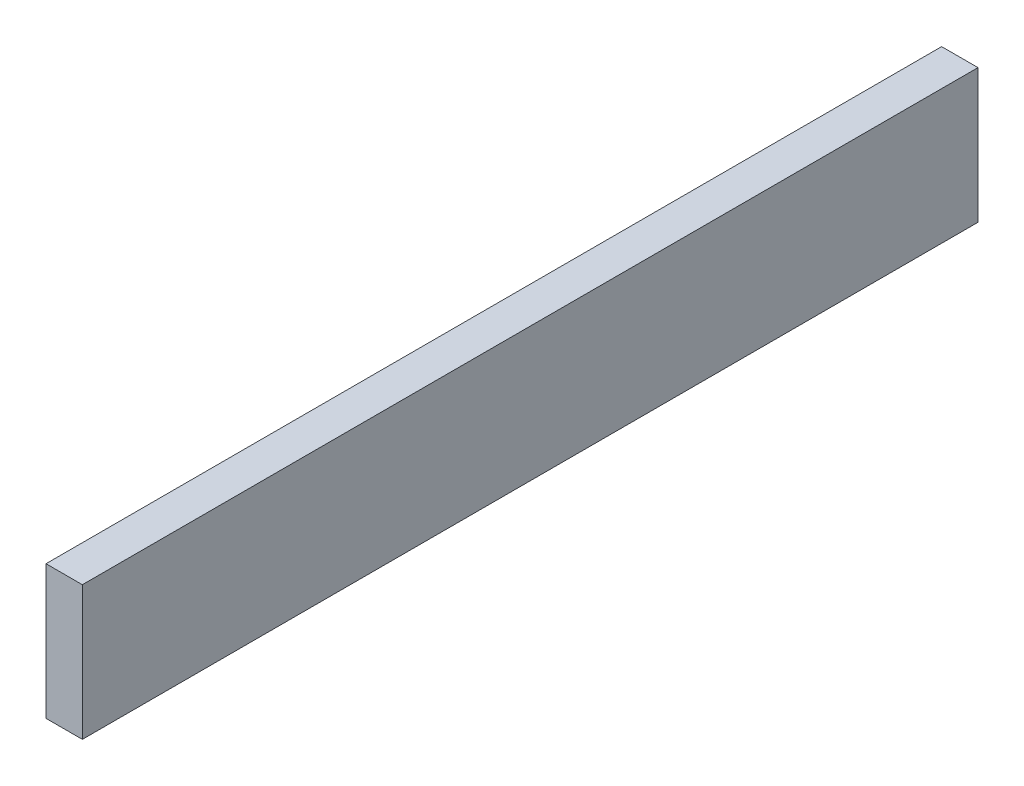
ISO-10303-21;
HEADER;
FILE_DESCRIPTION(('STEP AP214'),'2;1');
FILE_NAME('part.step','',(''),(''),'','','');
FILE_SCHEMA(('AUTOMOTIVE_DESIGN { 1 0 10303 214 1 1 1 1 }'));
ENDSEC;
DATA;
#1=APPLICATION_CONTEXT('core data for automotive mechanical design processes');
#2=APPLICATION_PROTOCOL_DEFINITION('international standard','automotive_design',2000,#1);
#3=PRODUCT_CONTEXT('',#1,'mechanical');
#4=PRODUCT('Part','Part','',(#3));
#5=PRODUCT_RELATED_PRODUCT_CATEGORY('part','',(#4));
#6=PRODUCT_DEFINITION_FORMATION('','',#4);
#7=PRODUCT_DEFINITION_CONTEXT('part definition',#1,'design');
#8=PRODUCT_DEFINITION('design','',#6,#7);
#9=PRODUCT_DEFINITION_SHAPE('','',#8);
#10=(LENGTH_UNIT() NAMED_UNIT(*) SI_UNIT(.MILLI.,.METRE.));
#11=(NAMED_UNIT(*) PLANE_ANGLE_UNIT() SI_UNIT($,.RADIAN.));
#12=(NAMED_UNIT(*) SI_UNIT($,.STERADIAN.) SOLID_ANGLE_UNIT());
#13=UNCERTAINTY_MEASURE_WITH_UNIT(LENGTH_MEASURE(1.E-05),#10,'distance_accuracy_value','');
#14=(GEOMETRIC_REPRESENTATION_CONTEXT(3) GLOBAL_UNCERTAINTY_ASSIGNED_CONTEXT((#13)) GLOBAL_UNIT_ASSIGNED_CONTEXT((#10,
#11,#12)) REPRESENTATION_CONTEXT('',''));
#15=CARTESIAN_POINT('',(0.,0.,0.));
#16=DIRECTION('',(0.,0.,1.));
#17=DIRECTION('',(1.,0.,0.));
#18=AXIS2_PLACEMENT_3D('',#15,#16,#17);
#19=CARTESIAN_POINT('',(18.9999999999999,0.,0.));
#20=DIRECTION('',(0.,0.,-1.));
#21=DIRECTION('',(-1.,0.,0.));
#22=AXIS2_PLACEMENT_3D('',#19,#20,#21);
#23=PLANE('',#22);
#24=DIRECTION('',(0.,-1.,0.));
#25=VECTOR('',#24,1.);
#26=CARTESIAN_POINT('',(0.,0.,0.));
#27=LINE('',#26,#25);
#28=CARTESIAN_POINT('',(0.,70.,0.));
#29=VERTEX_POINT('',#28);
#30=CARTESIAN_POINT('',(0.,0.,0.));
#31=VERTEX_POINT('',#30);
#32=EDGE_CURVE('E95',#29,#31,#27,.T.);
#33=ORIENTED_EDGE('',*,*,#32,.T.);
#34=DIRECTION('',(-1.,0.,0.));
#35=VECTOR('',#34,1.);
#36=CARTESIAN_POINT('',(18.9999999999999,0.,0.));
#37=LINE('',#36,#35);
#38=CARTESIAN_POINT('',(18.9999999999999,0.,0.));
#39=VERTEX_POINT('',#38);
#40=EDGE_CURVE('E11',#39,#31,#37,.T.);
#41=ORIENTED_EDGE('',*,*,#40,.F.);
#42=DIRECTION('',(0.,-1.,0.));
#43=VECTOR('',#42,1.);
#44=CARTESIAN_POINT('',(18.9999999999999,0.,0.));
#45=LINE('',#44,#43);
#46=CARTESIAN_POINT('',(18.9999999999999,70.,0.));
#47=VERTEX_POINT('',#46);
#48=EDGE_CURVE('E83',#47,#39,#45,.T.);
#49=ORIENTED_EDGE('',*,*,#48,.F.);
#50=DIRECTION('',(-1.,0.,0.));
#51=VECTOR('',#50,1.);
#52=CARTESIAN_POINT('',(18.9999999999999,70.,0.));
#53=LINE('',#52,#51);
#54=EDGE_CURVE('E91',#47,#29,#53,.T.);
#55=ORIENTED_EDGE('',*,*,#54,.T.);
#56=EDGE_LOOP('',(#33,#41,#49,#55));
#57=FACE_BOUND('',#56,.T.);
#58=ADVANCED_FACE('F32',(#57),#23,.F.);
#59=CARTESIAN_POINT('',(18.9999999999999,0.,0.));
#60=DIRECTION('',(0.,1.,0.));
#61=DIRECTION('',(0.,0.,1.));
#62=AXIS2_PLACEMENT_3D('',#59,#60,#61);
#63=PLANE('',#62);
#64=DIRECTION('',(0.,0.,-1.));
#65=VECTOR('',#64,1.);
#66=CARTESIAN_POINT('',(0.,0.,0.));
#67=LINE('',#66,#65);
#68=CARTESIAN_POINT('',(0.,0.,-468.));
#69=VERTEX_POINT('',#68);
#70=EDGE_CURVE('E87',#31,#69,#67,.T.);
#71=ORIENTED_EDGE('',*,*,#70,.T.);
#72=DIRECTION('',(-1.,0.,0.));
#73=VECTOR('',#72,1.);
#74=CARTESIAN_POINT('',(18.9999999999999,0.,-468.));
#75=LINE('',#74,#73);
#76=CARTESIAN_POINT('',(18.9999999999999,0.,-468.));
#77=VERTEX_POINT('',#76);
#78=EDGE_CURVE('E40',#77,#69,#75,.T.);
#79=ORIENTED_EDGE('',*,*,#78,.F.);
#80=DIRECTION('',(0.,0.,-1.));
#81=VECTOR('',#80,1.);
#82=CARTESIAN_POINT('',(18.9999999999999,0.,0.));
#83=LINE('',#82,#81);
#84=EDGE_CURVE('E78',#39,#77,#83,.T.);
#85=ORIENTED_EDGE('',*,*,#84,.F.);
#86=ORIENTED_EDGE('',*,*,#40,.T.);
#87=EDGE_LOOP('',(#71,#79,#85,#86));
#88=FACE_BOUND('',#87,.T.);
#89=ADVANCED_FACE('F86',(#88),#63,.F.);
#90=CARTESIAN_POINT('',(18.9999999999999,0.,-468.));
#91=DIRECTION('',(0.,0.,1.));
#92=DIRECTION('',(1.,0.,0.));
#93=AXIS2_PLACEMENT_3D('',#90,#91,#92);
#94=PLANE('',#93);
#95=DIRECTION('',(0.,1.,0.));
#96=VECTOR('',#95,1.);
#97=CARTESIAN_POINT('',(0.,0.,-468.));
#98=LINE('',#97,#96);
#99=CARTESIAN_POINT('',(0.,70.,-468.));
#100=VERTEX_POINT('',#99);
#101=EDGE_CURVE('E65',#69,#100,#98,.T.);
#102=ORIENTED_EDGE('',*,*,#101,.T.);
#103=DIRECTION('',(-1.,0.,0.));
#104=VECTOR('',#103,1.);
#105=CARTESIAN_POINT('',(18.9999999999999,70.,-468.));
#106=LINE('',#105,#104);
#107=CARTESIAN_POINT('',(18.9999999999999,70.,-468.));
#108=VERTEX_POINT('',#107);
#109=EDGE_CURVE('E88',#108,#100,#106,.T.);
#110=ORIENTED_EDGE('',*,*,#109,.F.);
#111=DIRECTION('',(0.,1.,0.));
#112=VECTOR('',#111,1.);
#113=CARTESIAN_POINT('',(18.9999999999999,0.,-468.));
#114=LINE('',#113,#112);
#115=EDGE_CURVE('E81',#77,#108,#114,.T.);
#116=ORIENTED_EDGE('',*,*,#115,.F.);
#117=ORIENTED_EDGE('',*,*,#78,.T.);
#118=EDGE_LOOP('',(#102,#110,#116,#117));
#119=FACE_BOUND('',#118,.T.);
#120=ADVANCED_FACE('F89',(#119),#94,.F.);
#121=CARTESIAN_POINT('',(18.9999999999999,70.,0.));
#122=DIRECTION('',(0.,-1.,0.));
#123=DIRECTION('',(0.,0.,-1.));
#124=AXIS2_PLACEMENT_3D('',#121,#122,#123);
#125=PLANE('',#124);
#126=DIRECTION('',(0.,0.,1.));
#127=VECTOR('',#126,1.);
#128=CARTESIAN_POINT('',(0.,70.,0.));
#129=LINE('',#128,#127);
#130=EDGE_CURVE('E71',#100,#29,#129,.T.);
#131=ORIENTED_EDGE('',*,*,#130,.T.);
#132=ORIENTED_EDGE('',*,*,#54,.F.);
#133=DIRECTION('',(0.,0.,1.));
#134=VECTOR('',#133,1.);
#135=CARTESIAN_POINT('',(18.9999999999999,70.,0.));
#136=LINE('',#135,#134);
#137=EDGE_CURVE('E48',#108,#47,#136,.T.);
#138=ORIENTED_EDGE('',*,*,#137,.F.);
#139=ORIENTED_EDGE('',*,*,#109,.T.);
#140=EDGE_LOOP('',(#131,#132,#138,#139));
#141=FACE_BOUND('',#140,.T.);
#142=ADVANCED_FACE('F102',(#141),#125,.F.);
#143=CARTESIAN_POINT('',(18.9999999999999,0.,0.));
#144=DIRECTION('',(-1.,0.,0.));
#145=DIRECTION('',(0.,0.,1.));
#146=AXIS2_PLACEMENT_3D('',#143,#144,#145);
#147=PLANE('',#146);
#148=ORIENTED_EDGE('',*,*,#48,.T.);
#149=ORIENTED_EDGE('',*,*,#84,.T.);
#150=ORIENTED_EDGE('',*,*,#115,.T.);
#151=ORIENTED_EDGE('',*,*,#137,.T.);
#152=EDGE_LOOP('',(#148,#149,#150,#151));
#153=FACE_BOUND('',#152,.T.);
#154=ADVANCED_FACE('F79',(#153),#147,.F.);
#155=CARTESIAN_POINT('',(0.,0.,0.));
#156=DIRECTION('',(-1.,0.,0.));
#157=DIRECTION('',(0.,0.,1.));
#158=AXIS2_PLACEMENT_3D('',#155,#156,#157);
#159=PLANE('',#158);
#160=ORIENTED_EDGE('',*,*,#32,.F.);
#161=ORIENTED_EDGE('',*,*,#130,.F.);
#162=ORIENTED_EDGE('',*,*,#101,.F.);
#163=ORIENTED_EDGE('',*,*,#70,.F.);
#164=EDGE_LOOP('',(#160,#161,#162,#163));
#165=FACE_BOUND('',#164,.T.);
#166=ADVANCED_FACE('F105',(#165),#159,.T.);
#167=CLOSED_SHELL('',(#58,#89,#120,#142,#154,#166));
#168=MANIFOLD_SOLID_BREP('B2',#167);
#169=ADVANCED_BREP_SHAPE_REPRESENTATION('',(#18,#168),#14);
#170=SHAPE_DEFINITION_REPRESENTATION(#9,#169);
ENDSEC;
END-ISO-10303-21;
